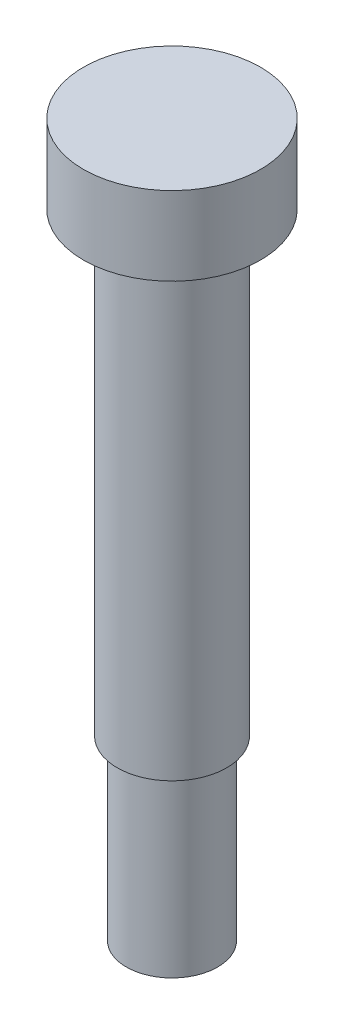
ISO-10303-21;
HEADER;
FILE_DESCRIPTION(('STEP AP214'),'2;1');
FILE_NAME('part.step','',(''),(''),'','','');
FILE_SCHEMA(('AUTOMOTIVE_DESIGN { 1 0 10303 214 1 1 1 1 }'));
ENDSEC;
DATA;
#1=APPLICATION_CONTEXT('core data for automotive mechanical design processes');
#2=APPLICATION_PROTOCOL_DEFINITION('international standard','automotive_design',2000,#1);
#3=PRODUCT_CONTEXT('',#1,'mechanical');
#4=PRODUCT('Part','Part','',(#3));
#5=PRODUCT_RELATED_PRODUCT_CATEGORY('part','',(#4));
#6=PRODUCT_DEFINITION_FORMATION('','',#4);
#7=PRODUCT_DEFINITION_CONTEXT('part definition',#1,'design');
#8=PRODUCT_DEFINITION('design','',#6,#7);
#9=PRODUCT_DEFINITION_SHAPE('','',#8);
#10=(LENGTH_UNIT() NAMED_UNIT(*) SI_UNIT(.MILLI.,.METRE.));
#11=(NAMED_UNIT(*) PLANE_ANGLE_UNIT() SI_UNIT($,.RADIAN.));
#12=(NAMED_UNIT(*) SI_UNIT($,.STERADIAN.) SOLID_ANGLE_UNIT());
#13=UNCERTAINTY_MEASURE_WITH_UNIT(LENGTH_MEASURE(1.E-05),#10,'distance_accuracy_value','');
#14=(GEOMETRIC_REPRESENTATION_CONTEXT(3) GLOBAL_UNCERTAINTY_ASSIGNED_CONTEXT((#13)) GLOBAL_UNIT_ASSIGNED_CONTEXT((#10,
#11,#12)) REPRESENTATION_CONTEXT('',''));
#15=CARTESIAN_POINT('',(0.,0.,0.));
#16=DIRECTION('',(0.,0.,1.));
#17=DIRECTION('',(1.,0.,0.));
#18=AXIS2_PLACEMENT_3D('',#15,#16,#17);
#19=CARTESIAN_POINT('',(0.,4.3,0.));
#20=DIRECTION('',(0.,-1.,0.));
#21=DIRECTION('',(0.,0.,-1.));
#22=AXIS2_PLACEMENT_3D('',#19,#20,#21);
#23=CYLINDRICAL_SURFACE('',#22,4.85);
#24=CARTESIAN_POINT('',(0.,4.3,0.));
#25=DIRECTION('',(0.,1.,0.));
#26=DIRECTION('',(0.,0.,1.));
#27=AXIS2_PLACEMENT_3D('',#24,#25,#26);
#28=CIRCLE('',#27,4.85);
#29=CARTESIAN_POINT('',(0.,4.3,-4.85));
#30=VERTEX_POINT('',#29);
#31=EDGE_CURVE('E54',#30,#30,#28,.T.);
#32=CARTESIAN_POINT('',(0.,0.,0.));
#33=DIRECTION('',(0.,1.,0.));
#34=DIRECTION('',(0.,0.,1.));
#35=AXIS2_PLACEMENT_3D('',#32,#33,#34);
#36=CIRCLE('',#35,4.85);
#37=CARTESIAN_POINT('',(0.,0.,-4.85));
#38=VERTEX_POINT('',#37);
#39=EDGE_CURVE('E46',#38,#38,#36,.T.);
#40=CARTESIAN_POINT('',(0.,4.3,-4.85));
#41=CARTESIAN_POINT('',(0.,4.25520833333333,-4.85));
#42=CARTESIAN_POINT('',(0.,4.21041666666667,-4.85));
#43=CARTESIAN_POINT('',(0.,4.12083333333333,-4.85));
#44=CARTESIAN_POINT('',(0.,4.07604166666667,-4.85));
#45=CARTESIAN_POINT('',(0.,3.98645833333333,-4.85));
#46=CARTESIAN_POINT('',(0.,3.94166666666667,-4.85));
#47=CARTESIAN_POINT('',(0.,3.85208333333333,-4.85));
#48=CARTESIAN_POINT('',(0.,3.80729166666667,-4.85));
#49=CARTESIAN_POINT('',(0.,3.71770833333333,-4.85));
#50=CARTESIAN_POINT('',(0.,3.67291666666667,-4.85));
#51=CARTESIAN_POINT('',(0.,3.58333333333333,-4.85));
#52=CARTESIAN_POINT('',(0.,3.53854166666667,-4.85));
#53=CARTESIAN_POINT('',(0.,3.44895833333333,-4.85));
#54=CARTESIAN_POINT('',(0.,3.40416666666667,-4.85));
#55=CARTESIAN_POINT('',(0.,3.31458333333333,-4.85));
#56=CARTESIAN_POINT('',(0.,3.26979166666667,-4.85));
#57=CARTESIAN_POINT('',(0.,3.18020833333333,-4.85));
#58=CARTESIAN_POINT('',(0.,3.13541666666667,-4.85));
#59=CARTESIAN_POINT('',(0.,3.04583333333333,-4.85));
#60=CARTESIAN_POINT('',(0.,3.00104166666667,-4.85));
#61=CARTESIAN_POINT('',(0.,2.91145833333333,-4.85));
#62=CARTESIAN_POINT('',(0.,2.86666666666667,-4.85));
#63=CARTESIAN_POINT('',(0.,2.77708333333333,-4.85));
#64=CARTESIAN_POINT('',(0.,2.73229166666667,-4.85));
#65=CARTESIAN_POINT('',(0.,2.64270833333333,-4.85));
#66=CARTESIAN_POINT('',(0.,2.59791666666667,-4.85));
#67=CARTESIAN_POINT('',(0.,2.50833333333333,-4.85));
#68=CARTESIAN_POINT('',(0.,2.46354166666667,-4.85));
#69=CARTESIAN_POINT('',(0.,2.37395833333333,-4.85));
#70=CARTESIAN_POINT('',(0.,2.32916666666667,-4.85));
#71=CARTESIAN_POINT('',(0.,2.23958333333333,-4.85));
#72=CARTESIAN_POINT('',(0.,2.19479166666667,-4.85));
#73=CARTESIAN_POINT('',(0.,2.10520833333333,-4.85));
#74=CARTESIAN_POINT('',(0.,2.06041666666667,-4.85));
#75=CARTESIAN_POINT('',(0.,1.97083333333333,-4.85));
#76=CARTESIAN_POINT('',(0.,1.92604166666667,-4.85));
#77=CARTESIAN_POINT('',(0.,1.83645833333333,-4.85));
#78=CARTESIAN_POINT('',(0.,1.79166666666667,-4.85));
#79=CARTESIAN_POINT('',(0.,1.70208333333333,-4.85));
#80=CARTESIAN_POINT('',(0.,1.65729166666667,-4.85));
#81=CARTESIAN_POINT('',(0.,1.56770833333333,-4.85));
#82=CARTESIAN_POINT('',(0.,1.52291666666667,-4.85));
#83=CARTESIAN_POINT('',(0.,1.43333333333333,-4.85));
#84=CARTESIAN_POINT('',(0.,1.38854166666667,-4.85));
#85=CARTESIAN_POINT('',(0.,1.29895833333333,-4.85));
#86=CARTESIAN_POINT('',(0.,1.25416666666667,-4.85));
#87=CARTESIAN_POINT('',(0.,1.16458333333333,-4.85));
#88=CARTESIAN_POINT('',(0.,1.11979166666667,-4.85));
#89=CARTESIAN_POINT('',(0.,1.03020833333333,-4.85));
#90=CARTESIAN_POINT('',(0.,0.985416666666666,-4.85));
#91=CARTESIAN_POINT('',(0.,0.895833333333333,-4.85));
#92=CARTESIAN_POINT('',(0.,0.851041666666666,-4.85));
#93=CARTESIAN_POINT('',(0.,0.761458333333333,-4.85));
#94=CARTESIAN_POINT('',(0.,0.716666666666666,-4.85));
#95=CARTESIAN_POINT('',(0.,0.627083333333333,-4.85));
#96=CARTESIAN_POINT('',(0.,0.582291666666666,-4.85));
#97=CARTESIAN_POINT('',(0.,0.492708333333333,-4.85));
#98=CARTESIAN_POINT('',(0.,0.447916666666666,-4.85));
#99=CARTESIAN_POINT('',(0.,0.358333333333333,-4.85));
#100=CARTESIAN_POINT('',(0.,0.313541666666666,-4.85));
#101=CARTESIAN_POINT('',(0.,0.223958333333332,-4.85));
#102=CARTESIAN_POINT('',(0.,0.179166666666666,-4.85));
#103=CARTESIAN_POINT('',(0.,0.0895833333333324,-4.85));
#104=CARTESIAN_POINT('',(0.,0.0447916666666658,-4.85));
#105=CARTESIAN_POINT('',(0.,0.,-4.85));
#106=B_SPLINE_CURVE_WITH_KNOTS('',3,(#40,#41,#42,#43,#44,#45,#46,#47,#48,#49,#50,#51,#52,#53,
#54,#55,#56,#57,#58,#59,#60,#61,#62,#63,#64,#65,#66,#67,#68,#69,#70,#71,#72,#73,#74,#75,#76,#77,
#78,#79,#80,#81,#82,#83,#84,#85,#86,#87,#88,#89,#90,#91,#92,#93,#94,#95,#96,#97,#98,#99,#100,
#101,#102,#103,#104,#105),.UNSPECIFIED.,.F.,.F.,(4,2,2,2,2,2,2,2,2,2,2,2,2,2,2,2,2,2,2,2,2,2,2,
2,2,2,2,2,2,2,2,2,4),(0.,0.134375,0.26875,0.403124999999999,0.5375,0.671875,0.80625,0.940625,
1.075,1.209375,1.34375,1.478125,1.6125,1.746875,1.88125,2.015625,2.15,2.284375,2.41875,2.553125,
2.6875,2.821875,2.95625,3.090625,3.225,3.359375,3.49375,3.628125,3.7625,3.896875,4.03125,
4.165625,4.3),.UNSPECIFIED.);
#107=EDGE_CURVE('BSEAM43',#30,#38,#106,.T.);
#108=ORIENTED_EDGE('',*,*,#31,.F.);
#109=ORIENTED_EDGE('',*,*,#39,.T.);
#110=ORIENTED_EDGE('',*,*,#107,.T.);
#111=ORIENTED_EDGE('',*,*,#107,.F.);
#112=EDGE_LOOP('',(#108,#110,#109,#111));
#113=FACE_BOUND('',#112,.T.);
#114=ADVANCED_FACE('F43',(#113),#23,.T.);
#115=CARTESIAN_POINT('',(0.,4.3,0.));
#116=DIRECTION('',(0.,1.,0.));
#117=DIRECTION('',(0.,0.,1.));
#118=AXIS2_PLACEMENT_3D('',#115,#116,#117);
#119=PLANE('',#118);
#120=ORIENTED_EDGE('',*,*,#31,.T.);
#121=EDGE_LOOP('',(#120));
#122=FACE_BOUND('',#121,.T.);
#123=ADVANCED_FACE('F75',(#122),#119,.T.);
#124=CARTESIAN_POINT('',(0.,0.,0.));
#125=DIRECTION('',(0.,1.,0.));
#126=DIRECTION('',(0.,0.,1.));
#127=AXIS2_PLACEMENT_3D('',#124,#125,#126);
#128=PLANE('',#127);
#129=CARTESIAN_POINT('',(0.,0.,0.));
#130=DIRECTION('',(0.,-1.,0.));
#131=DIRECTION('',(0.,0.,-1.));
#132=AXIS2_PLACEMENT_3D('',#129,#130,#131);
#133=CIRCLE('',#132,3.);
#134=CARTESIAN_POINT('',(0.,0.,-3.));
#135=VERTEX_POINT('',#134);
#136=EDGE_CURVE('E49',#135,#135,#133,.T.);
#137=ORIENTED_EDGE('',*,*,#136,.F.);
#138=EDGE_LOOP('',(#137));
#139=FACE_BOUND('',#138,.T.);
#140=ORIENTED_EDGE('',*,*,#39,.F.);
#141=EDGE_LOOP('',(#140));
#142=FACE_BOUND('',#141,.T.);
#143=ADVANCED_FACE('F69',(#139,#142),#128,.F.);
#144=CARTESIAN_POINT('',(0.,-25.,0.));
#145=DIRECTION('',(0.,1.,0.));
#146=DIRECTION('',(0.,0.,1.));
#147=AXIS2_PLACEMENT_3D('',#144,#145,#146);
#148=CYLINDRICAL_SURFACE('',#147,3.);
#149=CARTESIAN_POINT('',(0.,-25.,0.));
#150=DIRECTION('',(0.,-1.,0.));
#151=DIRECTION('',(0.,0.,-1.));
#152=AXIS2_PLACEMENT_3D('',#149,#150,#151);
#153=CIRCLE('',#152,3.);
#154=CARTESIAN_POINT('',(0.,-25.,-3.));
#155=VERTEX_POINT('',#154);
#156=EDGE_CURVE('E58',#155,#155,#153,.T.);
#157=ORIENTED_EDGE('',*,*,#156,.F.);
#158=EDGE_LOOP('',(#157));
#159=FACE_BOUND('',#158,.T.);
#160=ORIENTED_EDGE('',*,*,#136,.T.);
#161=EDGE_LOOP('',(#160));
#162=FACE_BOUND('',#161,.T.);
#163=ADVANCED_FACE('F72',(#159,#162),#148,.T.);
#164=CARTESIAN_POINT('',(0.,-25.,0.));
#165=DIRECTION('',(0.,-1.,0.));
#166=DIRECTION('',(0.,0.,-1.));
#167=AXIS2_PLACEMENT_3D('',#164,#165,#166);
#168=PLANE('',#167);
#169=CARTESIAN_POINT('',(0.,-25.,0.));
#170=DIRECTION('',(0.,-1.,0.));
#171=DIRECTION('',(0.,0.,-1.));
#172=AXIS2_PLACEMENT_3D('',#169,#170,#171);
#173=CIRCLE('',#172,2.5);
#174=CARTESIAN_POINT('',(0.,-25.,-2.5));
#175=VERTEX_POINT('',#174);
#176=EDGE_CURVE('E10',#175,#175,#173,.T.);
#177=ORIENTED_EDGE('',*,*,#176,.F.);
#178=EDGE_LOOP('',(#177));
#179=FACE_BOUND('',#178,.T.);
#180=ORIENTED_EDGE('',*,*,#156,.T.);
#181=EDGE_LOOP('',(#180));
#182=FACE_BOUND('',#181,.T.);
#183=ADVANCED_FACE('F80',(#179,#182),#168,.T.);
#184=CARTESIAN_POINT('',(0.,-34.7,0.));
#185=DIRECTION('',(0.,1.,0.));
#186=DIRECTION('',(0.,0.,1.));
#187=AXIS2_PLACEMENT_3D('',#184,#185,#186);
#188=CYLINDRICAL_SURFACE('',#187,2.5);
#189=CARTESIAN_POINT('',(0.,-34.7,0.));
#190=DIRECTION('',(0.,-1.,0.));
#191=DIRECTION('',(0.,0.,-1.));
#192=AXIS2_PLACEMENT_3D('',#189,#190,#191);
#193=CIRCLE('',#192,2.5);
#194=CARTESIAN_POINT('',(0.,-34.7,-2.5));
#195=VERTEX_POINT('',#194);
#196=EDGE_CURVE('E56',#195,#195,#193,.T.);
#197=ORIENTED_EDGE('',*,*,#196,.F.);
#198=EDGE_LOOP('',(#197));
#199=FACE_BOUND('',#198,.T.);
#200=ORIENTED_EDGE('',*,*,#176,.T.);
#201=EDGE_LOOP('',(#200));
#202=FACE_BOUND('',#201,.T.);
#203=ADVANCED_FACE('F110',(#199,#202),#188,.T.);
#204=CARTESIAN_POINT('',(0.,-34.7,0.));
#205=DIRECTION('',(0.,-1.,0.));
#206=DIRECTION('',(0.,0.,-1.));
#207=AXIS2_PLACEMENT_3D('',#204,#205,#206);
#208=PLANE('',#207);
#209=ORIENTED_EDGE('',*,*,#196,.T.);
#210=EDGE_LOOP('',(#209));
#211=FACE_BOUND('',#210,.T.);
#212=ADVANCED_FACE('F120',(#211),#208,.T.);
#213=CLOSED_SHELL('',(#114,#123,#143,#163,#183,#203,#212));
#214=MANIFOLD_SOLID_BREP('B2',#213);
#215=ADVANCED_BREP_SHAPE_REPRESENTATION('',(#18,#214),#14);
#216=SHAPE_DEFINITION_REPRESENTATION(#9,#215);
ENDSEC;
END-ISO-10303-21;
